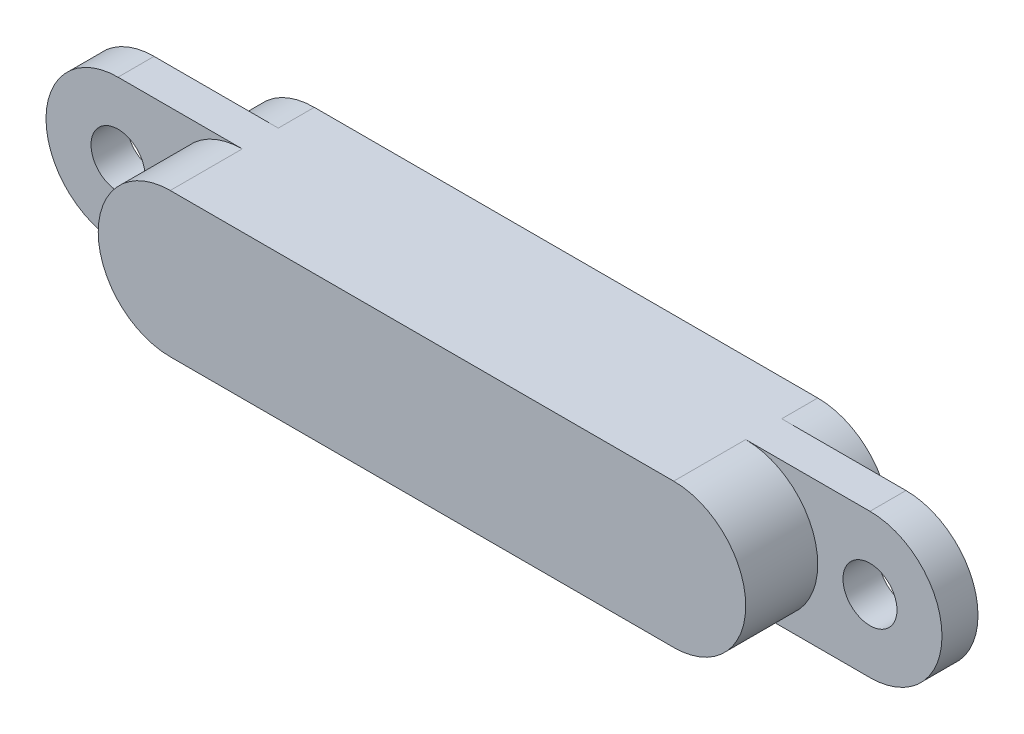
ISO-10303-21;
HEADER;
FILE_DESCRIPTION(('STEP AP214'),'2;1');
FILE_NAME('part.step','',(''),(''),'','','');
FILE_SCHEMA(('AUTOMOTIVE_DESIGN { 1 0 10303 214 1 1 1 1 }'));
ENDSEC;
DATA;
#1=APPLICATION_CONTEXT('core data for automotive mechanical design processes');
#2=APPLICATION_PROTOCOL_DEFINITION('international standard','automotive_design',2000,#1);
#3=PRODUCT_CONTEXT('',#1,'mechanical');
#4=PRODUCT('Part','Part','',(#3));
#5=PRODUCT_RELATED_PRODUCT_CATEGORY('part','',(#4));
#6=PRODUCT_DEFINITION_FORMATION('','',#4);
#7=PRODUCT_DEFINITION_CONTEXT('part definition',#1,'design');
#8=PRODUCT_DEFINITION('design','',#6,#7);
#9=PRODUCT_DEFINITION_SHAPE('','',#8);
#10=(LENGTH_UNIT() NAMED_UNIT(*) SI_UNIT(.MILLI.,.METRE.));
#11=(NAMED_UNIT(*) PLANE_ANGLE_UNIT() SI_UNIT($,.RADIAN.));
#12=(NAMED_UNIT(*) SI_UNIT($,.STERADIAN.) SOLID_ANGLE_UNIT());
#13=UNCERTAINTY_MEASURE_WITH_UNIT(LENGTH_MEASURE(1.E-05),#10,'distance_accuracy_value','');
#14=(GEOMETRIC_REPRESENTATION_CONTEXT(3) GLOBAL_UNCERTAINTY_ASSIGNED_CONTEXT((#13)) GLOBAL_UNIT_ASSIGNED_CONTEXT((#10,
#11,#12)) REPRESENTATION_CONTEXT('',''));
#15=CARTESIAN_POINT('',(0.,0.,0.));
#16=DIRECTION('',(0.,0.,1.));
#17=DIRECTION('',(1.,0.,0.));
#18=AXIS2_PLACEMENT_3D('',#15,#16,#17);
#19=CARTESIAN_POINT('',(-10.44,-2.,4.));
#20=DIRECTION('',(0.,1.,0.));
#21=DIRECTION('',(-1.,0.,0.));
#22=AXIS2_PLACEMENT_3D('',#19,#20,#21);
#23=PLANE('',#22);
#24=DIRECTION('',(0.,0.,1.));
#25=VECTOR('',#24,1.);
#26=CARTESIAN_POINT('',(-6.98999999999999,-2.,0.));
#27=LINE('',#26,#25);
#28=CARTESIAN_POINT('',(-6.98999999999999,-2.,0.));
#29=VERTEX_POINT('',#28);
#30=CARTESIAN_POINT('',(-6.98999999999999,-2.,1.));
#31=VERTEX_POINT('',#30);
#32=EDGE_CURVE('E123',#29,#31,#27,.T.);
#33=ORIENTED_EDGE('',*,*,#32,.F.);
#34=DIRECTION('',(1.,0.,0.));
#35=VECTOR('',#34,1.);
#36=CARTESIAN_POINT('',(-10.44,-2.,0.));
#37=LINE('',#36,#35);
#38=CARTESIAN_POINT('',(6.98999999999999,-2.,0.));
#39=VERTEX_POINT('',#38);
#40=EDGE_CURVE('E134',#29,#39,#37,.T.);
#41=ORIENTED_EDGE('',*,*,#40,.T.);
#42=DIRECTION('',(0.,0.,1.));
#43=VECTOR('',#42,1.);
#44=CARTESIAN_POINT('',(6.98999999999999,-2.,0.));
#45=LINE('',#44,#43);
#46=CARTESIAN_POINT('',(6.98999999999999,-2.,1.));
#47=VERTEX_POINT('',#46);
#48=EDGE_CURVE('E49',#39,#47,#45,.T.);
#49=ORIENTED_EDGE('',*,*,#48,.T.);
#50=DIRECTION('',(1.,0.,0.));
#51=VECTOR('',#50,1.);
#52=CARTESIAN_POINT('',(0.,-2.,1.));
#53=LINE('',#52,#51);
#54=CARTESIAN_POINT('',(10.44,-2.,1.));
#55=VERTEX_POINT('',#54);
#56=EDGE_CURVE('E170',#47,#55,#53,.T.);
#57=ORIENTED_EDGE('',*,*,#56,.T.);
#58=DIRECTION('',(0.,0.,-1.));
#59=VECTOR('',#58,1.);
#60=CARTESIAN_POINT('',(10.44,-2.,4.));
#61=LINE('',#60,#59);
#62=CARTESIAN_POINT('',(10.44,-2.,2.));
#63=VERTEX_POINT('',#62);
#64=EDGE_CURVE('E42',#63,#55,#61,.T.);
#65=ORIENTED_EDGE('',*,*,#64,.F.);
#66=DIRECTION('',(1.,0.,0.));
#67=VECTOR('',#66,1.);
#68=CARTESIAN_POINT('',(0.,-2.,2.));
#69=LINE('',#68,#67);
#70=CARTESIAN_POINT('',(6.98999999999999,-2.,2.));
#71=VERTEX_POINT('',#70);
#72=EDGE_CURVE('E168',#71,#63,#69,.T.);
#73=ORIENTED_EDGE('',*,*,#72,.F.);
#74=DIRECTION('',(0.,0.,1.));
#75=VECTOR('',#74,1.);
#76=CARTESIAN_POINT('',(6.98999999999999,-2.,2.));
#77=LINE('',#76,#75);
#78=CARTESIAN_POINT('',(6.98999999999999,-2.,4.));
#79=VERTEX_POINT('',#78);
#80=EDGE_CURVE('E217',#71,#79,#77,.T.);
#81=ORIENTED_EDGE('',*,*,#80,.T.);
#82=DIRECTION('',(1.,0.,0.));
#83=VECTOR('',#82,1.);
#84=CARTESIAN_POINT('',(-10.44,-2.,4.));
#85=LINE('',#84,#83);
#86=CARTESIAN_POINT('',(-6.98999999999999,-2.,4.));
#87=VERTEX_POINT('',#86);
#88=EDGE_CURVE('E143',#87,#79,#85,.T.);
#89=ORIENTED_EDGE('',*,*,#88,.F.);
#90=DIRECTION('',(0.,0.,1.));
#91=VECTOR('',#90,1.);
#92=CARTESIAN_POINT('',(-6.98999999999999,-2.,2.));
#93=LINE('',#92,#91);
#94=CARTESIAN_POINT('',(-6.98999999999999,-2.,2.));
#95=VERTEX_POINT('',#94);
#96=EDGE_CURVE('E141',#95,#87,#93,.T.);
#97=ORIENTED_EDGE('',*,*,#96,.F.);
#98=DIRECTION('',(1.,0.,0.));
#99=VECTOR('',#98,1.);
#100=CARTESIAN_POINT('',(0.,-2.,2.));
#101=LINE('',#100,#99);
#102=CARTESIAN_POINT('',(-10.44,-2.,2.));
#103=VERTEX_POINT('',#102);
#104=EDGE_CURVE('E196',#103,#95,#101,.T.);
#105=ORIENTED_EDGE('',*,*,#104,.F.);
#106=DIRECTION('',(0.,0.,-1.));
#107=VECTOR('',#106,1.);
#108=CARTESIAN_POINT('',(-10.44,-2.,4.));
#109=LINE('',#108,#107);
#110=CARTESIAN_POINT('',(-10.44,-2.,1.));
#111=VERTEX_POINT('',#110);
#112=EDGE_CURVE('E11',#103,#111,#109,.T.);
#113=ORIENTED_EDGE('',*,*,#112,.T.);
#114=DIRECTION('',(1.,0.,0.));
#115=VECTOR('',#114,1.);
#116=CARTESIAN_POINT('',(0.,-2.,1.));
#117=LINE('',#116,#115);
#118=EDGE_CURVE('E135',#111,#31,#117,.T.);
#119=ORIENTED_EDGE('',*,*,#118,.T.);
#120=EDGE_LOOP('',(#33,#41,#49,#57,#65,#73,#81,#89,#97,#105,#113,#119));
#121=FACE_BOUND('',#120,.T.);
#122=ADVANCED_FACE('F34',(#121),#23,.F.);
#123=CARTESIAN_POINT('',(-10.44,2.,4.));
#124=DIRECTION('',(0.,-1.,0.));
#125=DIRECTION('',(1.,0.,0.));
#126=AXIS2_PLACEMENT_3D('',#123,#124,#125);
#127=PLANE('',#126);
#128=DIRECTION('',(-1.,0.,0.));
#129=VECTOR('',#128,1.);
#130=CARTESIAN_POINT('',(-10.44,2.,0.));
#131=LINE('',#130,#129);
#132=CARTESIAN_POINT('',(6.98999999999999,2.,0.));
#133=VERTEX_POINT('',#132);
#134=CARTESIAN_POINT('',(-6.98999999999999,2.,0.));
#135=VERTEX_POINT('',#134);
#136=EDGE_CURVE('E140',#133,#135,#131,.T.);
#137=ORIENTED_EDGE('',*,*,#136,.T.);
#138=DIRECTION('',(0.,0.,1.));
#139=VECTOR('',#138,1.);
#140=CARTESIAN_POINT('',(-6.98999999999999,2.,0.));
#141=LINE('',#140,#139);
#142=CARTESIAN_POINT('',(-6.98999999999999,2.,1.));
#143=VERTEX_POINT('',#142);
#144=EDGE_CURVE('E57',#135,#143,#141,.T.);
#145=ORIENTED_EDGE('',*,*,#144,.T.);
#146=DIRECTION('',(-1.,0.,0.));
#147=VECTOR('',#146,1.);
#148=CARTESIAN_POINT('',(0.,2.,1.));
#149=LINE('',#148,#147);
#150=CARTESIAN_POINT('',(-10.44,2.,1.));
#151=VERTEX_POINT('',#150);
#152=EDGE_CURVE('E261',#143,#151,#149,.T.);
#153=ORIENTED_EDGE('',*,*,#152,.T.);
#154=DIRECTION('',(0.,0.,-1.));
#155=VECTOR('',#154,1.);
#156=CARTESIAN_POINT('',(-10.44,2.,4.));
#157=LINE('',#156,#155);
#158=CARTESIAN_POINT('',(-10.44,2.,2.));
#159=VERTEX_POINT('',#158);
#160=EDGE_CURVE('E151',#159,#151,#157,.T.);
#161=ORIENTED_EDGE('',*,*,#160,.F.);
#162=DIRECTION('',(-1.,0.,0.));
#163=VECTOR('',#162,1.);
#164=CARTESIAN_POINT('',(0.,2.,2.));
#165=LINE('',#164,#163);
#166=CARTESIAN_POINT('',(-6.98999999999999,2.,2.));
#167=VERTEX_POINT('',#166);
#168=EDGE_CURVE('E191',#167,#159,#165,.T.);
#169=ORIENTED_EDGE('',*,*,#168,.F.);
#170=DIRECTION('',(0.,0.,1.));
#171=VECTOR('',#170,1.);
#172=CARTESIAN_POINT('',(-6.98999999999999,2.,2.));
#173=LINE('',#172,#171);
#174=CARTESIAN_POINT('',(-6.98999999999999,2.,4.));
#175=VERTEX_POINT('',#174);
#176=EDGE_CURVE('E145',#167,#175,#173,.T.);
#177=ORIENTED_EDGE('',*,*,#176,.T.);
#178=DIRECTION('',(-1.,0.,0.));
#179=VECTOR('',#178,1.);
#180=CARTESIAN_POINT('',(-10.44,2.,4.));
#181=LINE('',#180,#179);
#182=CARTESIAN_POINT('',(6.98999999999999,2.,4.));
#183=VERTEX_POINT('',#182);
#184=EDGE_CURVE('E148',#183,#175,#181,.T.);
#185=ORIENTED_EDGE('',*,*,#184,.F.);
#186=DIRECTION('',(0.,0.,1.));
#187=VECTOR('',#186,1.);
#188=CARTESIAN_POINT('',(6.98999999999999,2.,2.));
#189=LINE('',#188,#187);
#190=CARTESIAN_POINT('',(6.98999999999999,2.,2.));
#191=VERTEX_POINT('',#190);
#192=EDGE_CURVE('E203',#191,#183,#189,.T.);
#193=ORIENTED_EDGE('',*,*,#192,.F.);
#194=DIRECTION('',(-1.,0.,0.));
#195=VECTOR('',#194,1.);
#196=CARTESIAN_POINT('',(0.,2.,2.));
#197=LINE('',#196,#195);
#198=CARTESIAN_POINT('',(10.44,2.,2.));
#199=VERTEX_POINT('',#198);
#200=EDGE_CURVE('E211',#199,#191,#197,.T.);
#201=ORIENTED_EDGE('',*,*,#200,.F.);
#202=DIRECTION('',(0.,0.,-1.));
#203=VECTOR('',#202,1.);
#204=CARTESIAN_POINT('',(10.44,2.,4.));
#205=LINE('',#204,#203);
#206=CARTESIAN_POINT('',(10.44,2.,1.));
#207=VERTEX_POINT('',#206);
#208=EDGE_CURVE('E154',#199,#207,#205,.T.);
#209=ORIENTED_EDGE('',*,*,#208,.T.);
#210=DIRECTION('',(-1.,0.,0.));
#211=VECTOR('',#210,1.);
#212=CARTESIAN_POINT('',(0.,2.,1.));
#213=LINE('',#212,#211);
#214=CARTESIAN_POINT('',(6.98999999999999,2.,1.));
#215=VERTEX_POINT('',#214);
#216=EDGE_CURVE('E175',#207,#215,#213,.T.);
#217=ORIENTED_EDGE('',*,*,#216,.T.);
#218=DIRECTION('',(0.,0.,1.));
#219=VECTOR('',#218,1.);
#220=CARTESIAN_POINT('',(6.98999999999999,2.,0.));
#221=LINE('',#220,#219);
#222=EDGE_CURVE('E185',#133,#215,#221,.T.);
#223=ORIENTED_EDGE('',*,*,#222,.F.);
#224=EDGE_LOOP('',(#137,#145,#153,#161,#169,#177,#185,#193,#201,#209,#217,#223));
#225=FACE_BOUND('',#224,.T.);
#226=ADVANCED_FACE('F229',(#225),#127,.F.);
#227=CARTESIAN_POINT('',(-10.44,0.,0.));
#228=DIRECTION('',(0.,0.,1.));
#229=DIRECTION('',(1.,0.,0.));
#230=AXIS2_PLACEMENT_3D('',#227,#228,#229);
#231=PLANE('',#230);
#232=CARTESIAN_POINT('',(-6.98999999999999,0.,0.));
#233=DIRECTION('',(0.,0.,1.));
#234=DIRECTION('',(1.,0.,0.));
#235=AXIS2_PLACEMENT_3D('',#232,#233,#234);
#236=CIRCLE('',#235,2.00000000000001);
#237=EDGE_CURVE('E120',#135,#29,#236,.T.);
#238=ORIENTED_EDGE('',*,*,#237,.F.);
#239=ORIENTED_EDGE('',*,*,#136,.F.);
#240=CARTESIAN_POINT('',(6.98999999999999,0.,0.));
#241=DIRECTION('',(0.,0.,1.));
#242=DIRECTION('',(1.,0.,0.));
#243=AXIS2_PLACEMENT_3D('',#240,#241,#242);
#244=CIRCLE('',#243,2.00000000000001);
#245=EDGE_CURVE('E139',#39,#133,#244,.T.);
#246=ORIENTED_EDGE('',*,*,#245,.F.);
#247=ORIENTED_EDGE('',*,*,#40,.F.);
#248=EDGE_LOOP('',(#238,#239,#246,#247));
#249=FACE_BOUND('',#248,.T.);
#250=ADVANCED_FACE('F138',(#249),#231,.F.);
#251=CARTESIAN_POINT('',(-10.44,0.,4.));
#252=DIRECTION('',(0.,0.,-1.));
#253=DIRECTION('',(-1.,0.,0.));
#254=AXIS2_PLACEMENT_3D('',#251,#252,#253);
#255=CYLINDRICAL_SURFACE('',#254,2.);
#256=ORIENTED_EDGE('',*,*,#160,.T.);
#257=CARTESIAN_POINT('',(-10.44,0.,1.));
#258=DIRECTION('',(0.,0.,1.));
#259=DIRECTION('',(1.,0.,0.));
#260=AXIS2_PLACEMENT_3D('',#257,#258,#259);
#261=CIRCLE('',#260,2.);
#262=EDGE_CURVE('E258',#151,#111,#261,.T.);
#263=ORIENTED_EDGE('',*,*,#262,.T.);
#264=ORIENTED_EDGE('',*,*,#112,.F.);
#265=CARTESIAN_POINT('',(-10.44,0.,2.));
#266=DIRECTION('',(0.,0.,1.));
#267=DIRECTION('',(1.,0.,0.));
#268=AXIS2_PLACEMENT_3D('',#265,#266,#267);
#269=CIRCLE('',#268,2.);
#270=EDGE_CURVE('E194',#159,#103,#269,.T.);
#271=ORIENTED_EDGE('',*,*,#270,.F.);
#272=EDGE_LOOP('',(#256,#263,#264,#271));
#273=FACE_BOUND('',#272,.T.);
#274=ADVANCED_FACE('F36',(#273),#255,.T.);
#275=CARTESIAN_POINT('',(10.44,0.,4.));
#276=DIRECTION('',(0.,0.,-1.));
#277=DIRECTION('',(-1.,0.,0.));
#278=AXIS2_PLACEMENT_3D('',#275,#276,#277);
#279=CYLINDRICAL_SURFACE('',#278,2.);
#280=ORIENTED_EDGE('',*,*,#64,.T.);
#281=CARTESIAN_POINT('',(10.44,0.,1.));
#282=DIRECTION('',(0.,0.,1.));
#283=DIRECTION('',(1.,0.,0.));
#284=AXIS2_PLACEMENT_3D('',#281,#282,#283);
#285=CIRCLE('',#284,2.);
#286=EDGE_CURVE('E163',#55,#207,#285,.T.);
#287=ORIENTED_EDGE('',*,*,#286,.T.);
#288=ORIENTED_EDGE('',*,*,#208,.F.);
#289=CARTESIAN_POINT('',(10.44,0.,2.));
#290=DIRECTION('',(0.,0.,1.));
#291=DIRECTION('',(1.,0.,0.));
#292=AXIS2_PLACEMENT_3D('',#289,#290,#291);
#293=CIRCLE('',#292,2.);
#294=EDGE_CURVE('E164',#63,#199,#293,.T.);
#295=ORIENTED_EDGE('',*,*,#294,.F.);
#296=EDGE_LOOP('',(#280,#287,#288,#295));
#297=FACE_BOUND('',#296,.T.);
#298=ADVANCED_FACE('F161',(#297),#279,.T.);
#299=CARTESIAN_POINT('',(-10.44,0.,4.));
#300=DIRECTION('',(0.,0.,1.));
#301=DIRECTION('',(1.,0.,0.));
#302=AXIS2_PLACEMENT_3D('',#299,#300,#301);
#303=PLANE('',#302);
#304=ORIENTED_EDGE('',*,*,#184,.T.);
#305=CARTESIAN_POINT('',(-6.98999999999999,0.,4.));
#306=DIRECTION('',(0.,0.,1.));
#307=DIRECTION('',(1.,0.,0.));
#308=AXIS2_PLACEMENT_3D('',#305,#306,#307);
#309=CIRCLE('',#308,2.00000000000001);
#310=EDGE_CURVE('E192',#175,#87,#309,.T.);
#311=ORIENTED_EDGE('',*,*,#310,.T.);
#312=ORIENTED_EDGE('',*,*,#88,.T.);
#313=CARTESIAN_POINT('',(6.98999999999999,0.,4.));
#314=DIRECTION('',(0.,0.,1.));
#315=DIRECTION('',(1.,0.,0.));
#316=AXIS2_PLACEMENT_3D('',#313,#314,#315);
#317=CIRCLE('',#316,2.00000000000001);
#318=EDGE_CURVE('E136',#79,#183,#317,.T.);
#319=ORIENTED_EDGE('',*,*,#318,.T.);
#320=EDGE_LOOP('',(#304,#311,#312,#319));
#321=FACE_BOUND('',#320,.T.);
#322=ADVANCED_FACE('F226',(#321),#303,.T.);
#323=CARTESIAN_POINT('',(10.44,0.,0.));
#324=DIRECTION('',(0.,0.,1.));
#325=DIRECTION('',(1.,0.,0.));
#326=AXIS2_PLACEMENT_3D('',#323,#324,#325);
#327=CYLINDRICAL_SURFACE('',#326,0.75);
#328=CARTESIAN_POINT('',(10.44,0.,1.));
#329=DIRECTION('',(0.,0.,1.));
#330=DIRECTION('',(1.,0.,0.));
#331=AXIS2_PLACEMENT_3D('',#328,#329,#330);
#332=CIRCLE('',#331,0.75);
#333=CARTESIAN_POINT('',(11.19,0.,1.));
#334=VERTEX_POINT('',#333);
#335=EDGE_CURVE('E182',#334,#334,#332,.F.);
#336=ORIENTED_EDGE('',*,*,#335,.T.);
#337=EDGE_LOOP('',(#336));
#338=FACE_BOUND('',#337,.T.);
#339=CARTESIAN_POINT('',(10.44,0.,2.));
#340=DIRECTION('',(0.,0.,1.));
#341=DIRECTION('',(1.,0.,0.));
#342=AXIS2_PLACEMENT_3D('',#339,#340,#341);
#343=CIRCLE('',#342,0.75);
#344=CARTESIAN_POINT('',(11.19,0.,2.));
#345=VERTEX_POINT('',#344);
#346=EDGE_CURVE('E214',#345,#345,#343,.F.);
#347=ORIENTED_EDGE('',*,*,#346,.F.);
#348=EDGE_LOOP('',(#347));
#349=FACE_BOUND('',#348,.T.);
#350=ADVANCED_FACE('F284',(#338,#349),#327,.F.);
#351=CARTESIAN_POINT('',(-10.44,0.,0.));
#352=DIRECTION('',(0.,0.,1.));
#353=DIRECTION('',(1.,0.,0.));
#354=AXIS2_PLACEMENT_3D('',#351,#352,#353);
#355=CYLINDRICAL_SURFACE('',#354,0.75);
#356=CARTESIAN_POINT('',(-10.44,0.,1.));
#357=DIRECTION('',(0.,0.,1.));
#358=DIRECTION('',(1.,0.,0.));
#359=AXIS2_PLACEMENT_3D('',#356,#357,#358);
#360=CIRCLE('',#359,0.75);
#361=CARTESIAN_POINT('',(-9.69,0.,1.));
#362=VERTEX_POINT('',#361);
#363=EDGE_CURVE('E129',#362,#362,#360,.F.);
#364=ORIENTED_EDGE('',*,*,#363,.T.);
#365=EDGE_LOOP('',(#364));
#366=FACE_BOUND('',#365,.T.);
#367=CARTESIAN_POINT('',(-10.44,0.,2.));
#368=DIRECTION('',(0.,0.,1.));
#369=DIRECTION('',(1.,0.,0.));
#370=AXIS2_PLACEMENT_3D('',#367,#368,#369);
#371=CIRCLE('',#370,0.75);
#372=CARTESIAN_POINT('',(-9.69,0.,2.));
#373=VERTEX_POINT('',#372);
#374=EDGE_CURVE('E199',#373,#373,#371,.F.);
#375=ORIENTED_EDGE('',*,*,#374,.F.);
#376=EDGE_LOOP('',(#375));
#377=FACE_BOUND('',#376,.T.);
#378=ADVANCED_FACE('F287',(#366,#377),#355,.F.);
#379=CARTESIAN_POINT('',(-6.98999999999999,0.,2.));
#380=DIRECTION('',(0.,0.,1.));
#381=DIRECTION('',(1.,0.,0.));
#382=AXIS2_PLACEMENT_3D('',#379,#380,#381);
#383=CYLINDRICAL_SURFACE('',#382,2.00000000000001);
#384=ORIENTED_EDGE('',*,*,#310,.F.);
#385=ORIENTED_EDGE('',*,*,#176,.F.);
#386=CARTESIAN_POINT('',(-6.98999999999999,0.,2.));
#387=DIRECTION('',(0.,0.,1.));
#388=DIRECTION('',(1.,0.,0.));
#389=AXIS2_PLACEMENT_3D('',#386,#387,#388);
#390=CIRCLE('',#389,2.00000000000001);
#391=EDGE_CURVE('E189',#167,#95,#390,.T.);
#392=ORIENTED_EDGE('',*,*,#391,.T.);
#393=ORIENTED_EDGE('',*,*,#96,.T.);
#394=EDGE_LOOP('',(#384,#385,#392,#393));
#395=FACE_BOUND('',#394,.T.);
#396=ADVANCED_FACE('F235',(#395),#383,.T.);
#397=CARTESIAN_POINT('',(0.,0.,2.));
#398=DIRECTION('',(0.,0.,1.));
#399=DIRECTION('',(1.,0.,0.));
#400=AXIS2_PLACEMENT_3D('',#397,#398,#399);
#401=PLANE('',#400);
#402=ORIENTED_EDGE('',*,*,#391,.F.);
#403=ORIENTED_EDGE('',*,*,#168,.T.);
#404=ORIENTED_EDGE('',*,*,#270,.T.);
#405=ORIENTED_EDGE('',*,*,#104,.T.);
#406=EDGE_LOOP('',(#402,#403,#404,#405));
#407=FACE_BOUND('',#406,.T.);
#408=ORIENTED_EDGE('',*,*,#374,.T.);
#409=EDGE_LOOP('',(#408));
#410=FACE_BOUND('',#409,.T.);
#411=ADVANCED_FACE('F237',(#407,#410),#401,.T.);
#412=CARTESIAN_POINT('',(6.98999999999999,0.,2.));
#413=DIRECTION('',(0.,0.,1.));
#414=DIRECTION('',(1.,0.,0.));
#415=AXIS2_PLACEMENT_3D('',#412,#413,#414);
#416=CYLINDRICAL_SURFACE('',#415,2.00000000000001);
#417=ORIENTED_EDGE('',*,*,#318,.F.);
#418=ORIENTED_EDGE('',*,*,#80,.F.);
#419=CARTESIAN_POINT('',(6.98999999999999,0.,2.));
#420=DIRECTION('',(0.,0.,1.));
#421=DIRECTION('',(1.,0.,0.));
#422=AXIS2_PLACEMENT_3D('',#419,#420,#421);
#423=CIRCLE('',#422,2.00000000000001);
#424=EDGE_CURVE('E207',#71,#191,#423,.T.);
#425=ORIENTED_EDGE('',*,*,#424,.T.);
#426=ORIENTED_EDGE('',*,*,#192,.T.);
#427=EDGE_LOOP('',(#417,#418,#425,#426));
#428=FACE_BOUND('',#427,.T.);
#429=ADVANCED_FACE('F245',(#428),#416,.T.);
#430=CARTESIAN_POINT('',(0.,0.,2.));
#431=DIRECTION('',(0.,0.,1.));
#432=DIRECTION('',(1.,0.,0.));
#433=AXIS2_PLACEMENT_3D('',#430,#431,#432);
#434=PLANE('',#433);
#435=ORIENTED_EDGE('',*,*,#424,.F.);
#436=ORIENTED_EDGE('',*,*,#72,.T.);
#437=ORIENTED_EDGE('',*,*,#294,.T.);
#438=ORIENTED_EDGE('',*,*,#200,.T.);
#439=EDGE_LOOP('',(#435,#436,#437,#438));
#440=FACE_BOUND('',#439,.T.);
#441=ORIENTED_EDGE('',*,*,#346,.T.);
#442=EDGE_LOOP('',(#441));
#443=FACE_BOUND('',#442,.T.);
#444=ADVANCED_FACE('F247',(#440,#443),#434,.T.);
#445=CARTESIAN_POINT('',(6.98999999999999,0.,0.));
#446=DIRECTION('',(0.,0.,1.));
#447=DIRECTION('',(1.,0.,0.));
#448=AXIS2_PLACEMENT_3D('',#445,#446,#447);
#449=CYLINDRICAL_SURFACE('',#448,2.00000000000001);
#450=CARTESIAN_POINT('',(6.98999999999999,0.,1.));
#451=DIRECTION('',(0.,0.,1.));
#452=DIRECTION('',(1.,0.,0.));
#453=AXIS2_PLACEMENT_3D('',#450,#451,#452);
#454=CIRCLE('',#453,2.00000000000001);
#455=EDGE_CURVE('E173',#47,#215,#454,.T.);
#456=ORIENTED_EDGE('',*,*,#455,.F.);
#457=ORIENTED_EDGE('',*,*,#48,.F.);
#458=ORIENTED_EDGE('',*,*,#245,.T.);
#459=ORIENTED_EDGE('',*,*,#222,.T.);
#460=EDGE_LOOP('',(#456,#457,#458,#459));
#461=FACE_BOUND('',#460,.T.);
#462=ADVANCED_FACE('F252',(#461),#449,.T.);
#463=CARTESIAN_POINT('',(0.,0.,1.));
#464=DIRECTION('',(0.,0.,1.));
#465=DIRECTION('',(1.,0.,0.));
#466=AXIS2_PLACEMENT_3D('',#463,#464,#465);
#467=PLANE('',#466);
#468=ORIENTED_EDGE('',*,*,#455,.T.);
#469=ORIENTED_EDGE('',*,*,#216,.F.);
#470=ORIENTED_EDGE('',*,*,#286,.F.);
#471=ORIENTED_EDGE('',*,*,#56,.F.);
#472=EDGE_LOOP('',(#468,#469,#470,#471));
#473=FACE_BOUND('',#472,.T.);
#474=ORIENTED_EDGE('',*,*,#335,.F.);
#475=EDGE_LOOP('',(#474));
#476=FACE_BOUND('',#475,.T.);
#477=ADVANCED_FACE('F250',(#473,#476),#467,.F.);
#478=CARTESIAN_POINT('',(-6.98999999999999,0.,0.));
#479=DIRECTION('',(0.,0.,1.));
#480=DIRECTION('',(1.,0.,0.));
#481=AXIS2_PLACEMENT_3D('',#478,#479,#480);
#482=CYLINDRICAL_SURFACE('',#481,2.00000000000001);
#483=CARTESIAN_POINT('',(-6.98999999999999,0.,1.));
#484=DIRECTION('',(0.,0.,1.));
#485=DIRECTION('',(1.,0.,0.));
#486=AXIS2_PLACEMENT_3D('',#483,#484,#485);
#487=CIRCLE('',#486,2.00000000000001);
#488=EDGE_CURVE('E187',#143,#31,#487,.T.);
#489=ORIENTED_EDGE('',*,*,#488,.F.);
#490=ORIENTED_EDGE('',*,*,#144,.F.);
#491=ORIENTED_EDGE('',*,*,#237,.T.);
#492=ORIENTED_EDGE('',*,*,#32,.T.);
#493=EDGE_LOOP('',(#489,#490,#491,#492));
#494=FACE_BOUND('',#493,.T.);
#495=ADVANCED_FACE('F122',(#494),#482,.T.);
#496=CARTESIAN_POINT('',(0.,0.,1.));
#497=DIRECTION('',(0.,0.,1.));
#498=DIRECTION('',(1.,0.,0.));
#499=AXIS2_PLACEMENT_3D('',#496,#497,#498);
#500=PLANE('',#499);
#501=ORIENTED_EDGE('',*,*,#488,.T.);
#502=ORIENTED_EDGE('',*,*,#118,.F.);
#503=ORIENTED_EDGE('',*,*,#262,.F.);
#504=ORIENTED_EDGE('',*,*,#152,.F.);
#505=EDGE_LOOP('',(#501,#502,#503,#504));
#506=FACE_BOUND('',#505,.T.);
#507=ORIENTED_EDGE('',*,*,#363,.F.);
#508=EDGE_LOOP('',(#507));
#509=FACE_BOUND('',#508,.T.);
#510=ADVANCED_FACE('F266',(#506,#509),#500,.F.);
#511=CLOSED_SHELL('',(#122,#226,#250,#274,#298,#322,#350,#378,#396,#411,#429,#444,#462,#477,
#495,#510));
#512=MANIFOLD_SOLID_BREP('B2',#511);
#513=ADVANCED_BREP_SHAPE_REPRESENTATION('',(#18,#512),#14);
#514=SHAPE_DEFINITION_REPRESENTATION(#9,#513);
ENDSEC;
END-ISO-10303-21;
